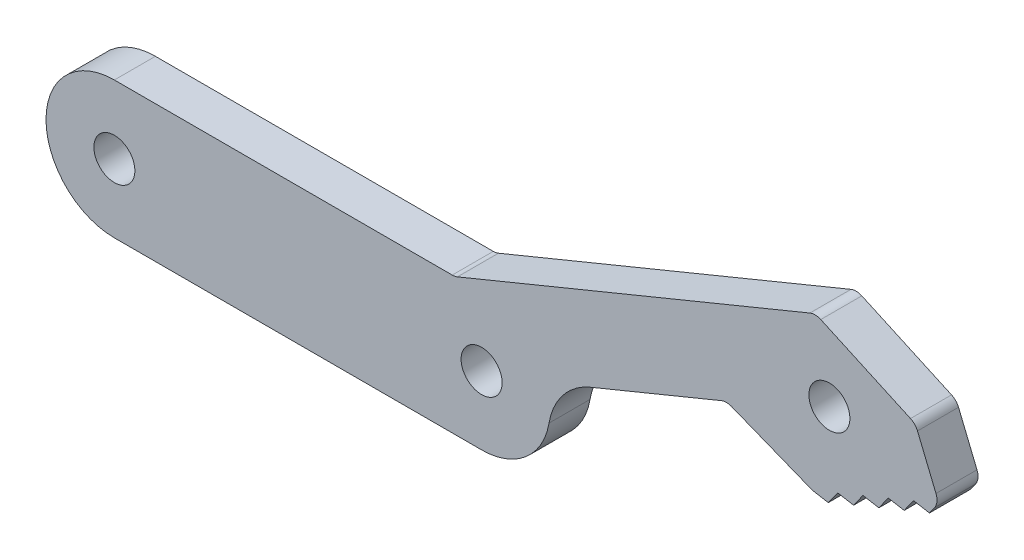
ISO-10303-21;
HEADER;
FILE_DESCRIPTION(('STEP AP214'),'2;1');
FILE_NAME('part.step','',(''),(''),'','','');
FILE_SCHEMA(('AUTOMOTIVE_DESIGN { 1 0 10303 214 1 1 1 1 }'));
ENDSEC;
DATA;
#1=APPLICATION_CONTEXT('core data for automotive mechanical design processes');
#2=APPLICATION_PROTOCOL_DEFINITION('international standard','automotive_design',2000,#1);
#3=PRODUCT_CONTEXT('',#1,'mechanical');
#4=PRODUCT('Part','Part','',(#3));
#5=PRODUCT_RELATED_PRODUCT_CATEGORY('part','',(#4));
#6=PRODUCT_DEFINITION_FORMATION('','',#4);
#7=PRODUCT_DEFINITION_CONTEXT('part definition',#1,'design');
#8=PRODUCT_DEFINITION('design','',#6,#7);
#9=PRODUCT_DEFINITION_SHAPE('','',#8);
#10=(LENGTH_UNIT() NAMED_UNIT(*) SI_UNIT(.MILLI.,.METRE.));
#11=(NAMED_UNIT(*) PLANE_ANGLE_UNIT() SI_UNIT($,.RADIAN.));
#12=(NAMED_UNIT(*) SI_UNIT($,.STERADIAN.) SOLID_ANGLE_UNIT());
#13=UNCERTAINTY_MEASURE_WITH_UNIT(LENGTH_MEASURE(1.E-05),#10,'distance_accuracy_value','');
#14=(GEOMETRIC_REPRESENTATION_CONTEXT(3) GLOBAL_UNCERTAINTY_ASSIGNED_CONTEXT((#13)) GLOBAL_UNIT_ASSIGNED_CONTEXT((#10,
#11,#12)) REPRESENTATION_CONTEXT('',''));
#15=CARTESIAN_POINT('',(0.,0.,0.));
#16=DIRECTION('',(0.,0.,1.));
#17=DIRECTION('',(1.,0.,0.));
#18=AXIS2_PLACEMENT_3D('',#15,#16,#17);
#19=CARTESIAN_POINT('',(34.3437879954881,-24.4421255077163,3.));
#20=DIRECTION('',(-0.814732571298574,0.579836905746108,0.));
#21=DIRECTION('',(-0.579836905746108,-0.814732571298574,0.));
#22=AXIS2_PLACEMENT_3D('',#19,#20,#21);
#23=PLANE('',#22);
#24=DIRECTION('',(0.,0.,1.));
#25=VECTOR('',#24,1.);
#26=CARTESIAN_POINT('',(56.5938553943796,6.82158751886203,3.));
#27=LINE('',#26,#25);
#28=CARTESIAN_POINT('',(56.5938553943796,6.82158751886203,0.));
#29=VERTEX_POINT('',#28);
#30=CARTESIAN_POINT('',(56.5938553943796,6.82158751886203,3.));
#31=VERTEX_POINT('',#30);
#32=EDGE_CURVE('E389',#29,#31,#27,.T.);
#33=ORIENTED_EDGE('',*,*,#32,.T.);
#34=DIRECTION('',(-0.579836905746108,-0.814732571298574,0.));
#35=VECTOR('',#34,1.);
#36=CARTESIAN_POINT('',(34.3437879954881,-24.4421255077163,3.));
#37=LINE('',#36,#35);
#38=CARTESIAN_POINT('',(55.9085431162351,5.85865082238394,3.));
#39=VERTEX_POINT('',#38);
#40=EDGE_CURVE('E412',#39,#31,#37,.F.);
#41=ORIENTED_EDGE('',*,*,#40,.F.);
#42=DIRECTION('',(0.,0.,1.));
#43=VECTOR('',#42,1.);
#44=CARTESIAN_POINT('',(55.9085431162351,5.85865082238394,3.));
#45=LINE('',#44,#43);
#46=CARTESIAN_POINT('',(55.9085431162351,5.85865082238394,0.));
#47=VERTEX_POINT('',#46);
#48=EDGE_CURVE('E398',#39,#47,#45,.F.);
#49=ORIENTED_EDGE('',*,*,#48,.T.);
#50=DIRECTION('',(-0.579836905746108,-0.814732571298574,0.));
#51=VECTOR('',#50,1.);
#52=CARTESIAN_POINT('',(34.3437879954881,-24.4421255077163,0.));
#53=LINE('',#52,#51);
#54=EDGE_CURVE('E404',#29,#47,#53,.T.);
#55=ORIENTED_EDGE('',*,*,#54,.F.);
#56=EDGE_LOOP('',(#33,#41,#49,#55));
#57=FACE_BOUND('',#56,.T.);
#58=ADVANCED_FACE('F16',(#57),#23,.F.);
#59=CARTESIAN_POINT('',(2.62825831831238,15.1201128790649,3.));
#60=DIRECTION('',(0.171257275030375,0.985226342395074,0.));
#61=DIRECTION('',(-0.985226342395074,0.171257275030375,0.));
#62=AXIS2_PLACEMENT_3D('',#59,#60,#61);
#63=PLANE('',#62);
#64=ORIENTED_EDGE('',*,*,#48,.F.);
#65=DIRECTION('',(-0.985226342395074,0.171257275030375,0.));
#66=VECTOR('',#65,1.);
#67=CARTESIAN_POINT('',(2.62825831831238,15.1201128790649,3.));
#68=LINE('',#67,#66);
#69=CARTESIAN_POINT('',(54.7440989380466,6.06106069339561,3.));
#70=VERTEX_POINT('',#69);
#71=EDGE_CURVE('E401',#70,#39,#68,.F.);
#72=ORIENTED_EDGE('',*,*,#71,.F.);
#73=DIRECTION('',(0.,0.,1.));
#74=VECTOR('',#73,1.);
#75=CARTESIAN_POINT('',(54.7440989380465,6.06106069339562,3.));
#76=LINE('',#75,#74);
#77=CARTESIAN_POINT('',(54.7440989380466,6.06106069339561,0.));
#78=VERTEX_POINT('',#77);
#79=EDGE_CURVE('E370',#70,#78,#76,.F.);
#80=ORIENTED_EDGE('',*,*,#79,.T.);
#81=DIRECTION('',(-0.985226342395074,0.171257275030375,0.));
#82=VECTOR('',#81,1.);
#83=CARTESIAN_POINT('',(2.62825831831238,15.1201128790649,0.));
#84=LINE('',#83,#82);
#85=EDGE_CURVE('E396',#47,#78,#84,.T.);
#86=ORIENTED_EDGE('',*,*,#85,.F.);
#87=EDGE_LOOP('',(#64,#72,#80,#86));
#88=FACE_BOUND('',#87,.T.);
#89=ADVANCED_FACE('F539',(#88),#63,.F.);
#90=CARTESIAN_POINT('',(2.81083147134707,16.1704383601417,3.));
#91=DIRECTION('',(0.171257275030359,0.985226342395078,0.));
#92=DIRECTION('',(-0.985226342395078,0.171257275030359,0.));
#93=AXIS2_PLACEMENT_3D('',#90,#91,#92);
#94=PLANE('',#93);
#95=DIRECTION('',(0.,0.,1.));
#96=VECTOR('',#95,1.);
#97=CARTESIAN_POINT('',(57.7582995725681,6.61917764785032,3.));
#98=LINE('',#97,#96);
#99=CARTESIAN_POINT('',(57.7582995725682,6.61917764785035,0.));
#100=VERTEX_POINT('',#99);
#101=CARTESIAN_POINT('',(57.7582995725682,6.61917764785035,3.));
#102=VERTEX_POINT('',#101);
#103=EDGE_CURVE('E361',#100,#102,#98,.T.);
#104=ORIENTED_EDGE('',*,*,#103,.T.);
#105=DIRECTION('',(-0.985226342395078,0.171257275030359,0.));
#106=VECTOR('',#105,1.);
#107=CARTESIAN_POINT('',(2.81083147134707,16.1704383601417,3.));
#108=LINE('',#107,#106);
#109=EDGE_CURVE('E385',#31,#102,#108,.F.);
#110=ORIENTED_EDGE('',*,*,#109,.F.);
#111=ORIENTED_EDGE('',*,*,#32,.F.);
#112=DIRECTION('',(-0.985226342395078,0.171257275030359,0.));
#113=VECTOR('',#112,1.);
#114=CARTESIAN_POINT('',(2.81083147134707,16.1704383601417,0.));
#115=LINE('',#114,#113);
#116=EDGE_CURVE('E376',#100,#29,#115,.T.);
#117=ORIENTED_EDGE('',*,*,#116,.F.);
#118=EDGE_LOOP('',(#104,#110,#111,#117));
#119=FACE_BOUND('',#118,.T.);
#120=ADVANCED_FACE('F532',(#119),#94,.F.);
#121=CARTESIAN_POINT('',(33.4752217147507,-23.8239756970912,3.));
#122=DIRECTION('',(-0.814732571298577,0.579836905746104,0.));
#123=DIRECTION('',(-0.579836905746104,-0.814732571298577,0.));
#124=AXIS2_PLACEMENT_3D('',#121,#122,#123);
#125=PLANE('',#124);
#126=ORIENTED_EDGE('',*,*,#79,.F.);
#127=DIRECTION('',(-0.579836905746104,-0.814732571298577,0.));
#128=VECTOR('',#127,1.);
#129=CARTESIAN_POINT('',(33.4752217147507,-23.8239756970912,3.));
#130=LINE('',#129,#128);
#131=CARTESIAN_POINT('',(54.058786659902,5.09812399691753,3.));
#132=VERTEX_POINT('',#131);
#133=EDGE_CURVE('E373',#132,#70,#130,.F.);
#134=ORIENTED_EDGE('',*,*,#133,.F.);
#135=DIRECTION('',(0.,0.,1.));
#136=VECTOR('',#135,1.);
#137=CARTESIAN_POINT('',(54.058786659902,5.09812399691753,3.));
#138=LINE('',#137,#136);
#139=CARTESIAN_POINT('',(54.058786659902,5.09812399691753,0.));
#140=VERTEX_POINT('',#139);
#141=EDGE_CURVE('E342',#132,#140,#138,.F.);
#142=ORIENTED_EDGE('',*,*,#141,.T.);
#143=DIRECTION('',(-0.579836905746104,-0.814732571298577,0.));
#144=VECTOR('',#143,1.);
#145=CARTESIAN_POINT('',(33.4752217147507,-23.8239756970912,0.));
#146=LINE('',#145,#144);
#147=EDGE_CURVE('E368',#78,#140,#146,.T.);
#148=ORIENTED_EDGE('',*,*,#147,.F.);
#149=EDGE_LOOP('',(#126,#134,#142,#148));
#150=FACE_BOUND('',#149,.T.);
#151=ADVANCED_FACE('F542',(#150),#125,.F.);
#152=CARTESIAN_POINT('',(35.2123542762261,-25.0602753183414,3.));
#153=DIRECTION('',(-0.814732571298576,0.579836905746104,0.));
#154=DIRECTION('',(-0.579836905746104,-0.814732571298576,0.));
#155=AXIS2_PLACEMENT_3D('',#152,#153,#154);
#156=PLANE('',#155);
#157=DIRECTION('',(0.,0.,1.));
#158=VECTOR('',#157,1.);
#159=CARTESIAN_POINT('',(58.4436118507129,7.58211434432848,3.));
#160=LINE('',#159,#158);
#161=CARTESIAN_POINT('',(58.4436118507128,7.58211434432845,0.));
#162=VERTEX_POINT('',#161);
#163=CARTESIAN_POINT('',(58.4436118507128,7.58211434432845,3.));
#164=VERTEX_POINT('',#163);
#165=EDGE_CURVE('E333',#162,#164,#160,.T.);
#166=ORIENTED_EDGE('',*,*,#165,.T.);
#167=DIRECTION('',(-0.579836905746104,-0.814732571298576,0.));
#168=VECTOR('',#167,1.);
#169=CARTESIAN_POINT('',(35.2123542762261,-25.0602753183414,3.));
#170=LINE('',#169,#168);
#171=EDGE_CURVE('E357',#102,#164,#170,.F.);
#172=ORIENTED_EDGE('',*,*,#171,.F.);
#173=ORIENTED_EDGE('',*,*,#103,.F.);
#174=DIRECTION('',(-0.579836905746104,-0.814732571298576,0.));
#175=VECTOR('',#174,1.);
#176=CARTESIAN_POINT('',(35.2123542762261,-25.0602753183414,0.));
#177=LINE('',#176,#175);
#178=EDGE_CURVE('E348',#162,#100,#177,.T.);
#179=ORIENTED_EDGE('',*,*,#178,.F.);
#180=EDGE_LOOP('',(#166,#172,#173,#179));
#181=FACE_BOUND('',#180,.T.);
#182=ADVANCED_FACE('F528',(#181),#156,.F.);
#183=CARTESIAN_POINT('',(2.44568516527722,14.0697873979871,3.));
#184=DIRECTION('',(0.171257275030374,0.985226342395075,0.));
#185=DIRECTION('',(-0.985226342395075,0.171257275030374,0.));
#186=AXIS2_PLACEMENT_3D('',#183,#184,#185);
#187=PLANE('',#186);
#188=ORIENTED_EDGE('',*,*,#141,.F.);
#189=DIRECTION('',(-0.985226342395075,0.171257275030374,0.));
#190=VECTOR('',#189,1.);
#191=CARTESIAN_POINT('',(2.44568516527722,14.0697873979871,3.));
#192=LINE('',#191,#190);
#193=CARTESIAN_POINT('',(52.8943424817137,5.30053386792931,3.));
#194=VERTEX_POINT('',#193);
#195=EDGE_CURVE('E345',#194,#132,#192,.F.);
#196=ORIENTED_EDGE('',*,*,#195,.F.);
#197=DIRECTION('',(0.,0.,1.));
#198=VECTOR('',#197,1.);
#199=CARTESIAN_POINT('',(52.8943424817137,5.30053386792931,3.));
#200=LINE('',#199,#198);
#201=CARTESIAN_POINT('',(52.8943424817137,5.30053386792931,0.));
#202=VERTEX_POINT('',#201);
#203=EDGE_CURVE('E316',#194,#202,#200,.F.);
#204=ORIENTED_EDGE('',*,*,#203,.T.);
#205=DIRECTION('',(-0.985226342395075,0.171257275030374,0.));
#206=VECTOR('',#205,1.);
#207=CARTESIAN_POINT('',(2.44568516527722,14.0697873979871,0.));
#208=LINE('',#207,#206);
#209=EDGE_CURVE('E340',#140,#202,#208,.T.);
#210=ORIENTED_EDGE('',*,*,#209,.F.);
#211=EDGE_LOOP('',(#188,#196,#204,#210));
#212=FACE_BOUND('',#211,.T.);
#213=ADVANCED_FACE('F546',(#212),#187,.F.);
#214=CARTESIAN_POINT('',(2.9934046243824,17.2207638412199,3.));
#215=DIRECTION('',(0.171257275030367,0.985226342395076,0.));
#216=DIRECTION('',(-0.985226342395076,0.171257275030367,0.));
#217=AXIS2_PLACEMENT_3D('',#214,#215,#216);
#218=PLANE('',#217);
#219=DIRECTION('',(0.,0.,1.));
#220=VECTOR('',#219,1.);
#221=CARTESIAN_POINT('',(59.6080560289013,7.37970447331675,3.));
#222=LINE('',#221,#220);
#223=CARTESIAN_POINT('',(59.6080560289013,7.37970447331675,0.));
#224=VERTEX_POINT('',#223);
#225=CARTESIAN_POINT('',(59.6080560289013,7.37970447331675,3.));
#226=VERTEX_POINT('',#225);
#227=EDGE_CURVE('E302',#224,#226,#222,.T.);
#228=ORIENTED_EDGE('',*,*,#227,.T.);
#229=DIRECTION('',(-0.985226342395076,0.171257275030367,0.));
#230=VECTOR('',#229,1.);
#231=CARTESIAN_POINT('',(2.9934046243824,17.2207638412199,3.));
#232=LINE('',#231,#230);
#233=EDGE_CURVE('E329',#164,#226,#232,.F.);
#234=ORIENTED_EDGE('',*,*,#233,.F.);
#235=ORIENTED_EDGE('',*,*,#165,.F.);
#236=DIRECTION('',(-0.985226342395076,0.171257275030367,0.));
#237=VECTOR('',#236,1.);
#238=CARTESIAN_POINT('',(2.9934046243824,17.2207638412199,0.));
#239=LINE('',#238,#237);
#240=EDGE_CURVE('E317',#224,#162,#239,.T.);
#241=ORIENTED_EDGE('',*,*,#240,.F.);
#242=EDGE_LOOP('',(#228,#234,#235,#241));
#243=FACE_BOUND('',#242,.T.);
#244=ADVANCED_FACE('F524',(#243),#218,.F.);
#245=CARTESIAN_POINT('',(32.606655434013,-23.2058258864661,3.));
#246=DIRECTION('',(-0.814732571298577,0.579836905746104,0.));
#247=DIRECTION('',(-0.579836905746104,-0.814732571298577,0.));
#248=AXIS2_PLACEMENT_3D('',#245,#246,#247);
#249=PLANE('',#248);
#250=ORIENTED_EDGE('',*,*,#203,.F.);
#251=DIRECTION('',(-0.579836905746104,-0.814732571298577,0.));
#252=VECTOR('',#251,1.);
#253=CARTESIAN_POINT('',(32.606655434013,-23.2058258864661,3.));
#254=LINE('',#253,#252);
#255=CARTESIAN_POINT('',(52.2090302035688,4.33759717145109,3.));
#256=VERTEX_POINT('',#255);
#257=EDGE_CURVE('E313',#256,#194,#254,.F.);
#258=ORIENTED_EDGE('',*,*,#257,.F.);
#259=DIRECTION('',(0.,0.,1.));
#260=VECTOR('',#259,1.);
#261=CARTESIAN_POINT('',(52.2090302035688,4.33759717145109,3.));
#262=LINE('',#261,#260);
#263=CARTESIAN_POINT('',(52.2090302035688,4.33759717145109,0.));
#264=VERTEX_POINT('',#263);
#265=EDGE_CURVE('E296',#256,#264,#262,.F.);
#266=ORIENTED_EDGE('',*,*,#265,.T.);
#267=DIRECTION('',(-0.579836905746104,-0.814732571298577,0.));
#268=VECTOR('',#267,1.);
#269=CARTESIAN_POINT('',(32.606655434013,-23.2058258864661,0.));
#270=LINE('',#269,#268);
#271=EDGE_CURVE('E90',#202,#264,#270,.T.);
#272=ORIENTED_EDGE('',*,*,#271,.F.);
#273=EDGE_LOOP('',(#250,#258,#266,#272));
#274=FACE_BOUND('',#273,.T.);
#275=ADVANCED_FACE('F549',(#274),#249,.F.);
#276=CARTESIAN_POINT('',(36.080920556963,-25.6784251289667,3.));
#277=DIRECTION('',(-0.814732571298569,0.579836905746115,0.));
#278=DIRECTION('',(-0.579836905746115,-0.814732571298569,0.));
#279=AXIS2_PLACEMENT_3D('',#276,#277,#278);
#280=PLANE('',#279);
#281=DIRECTION('',(0.,0.,1.));
#282=VECTOR('',#281,1.);
#283=CARTESIAN_POINT('',(59.9733532795215,7.8929859932349,3.));
#284=LINE('',#283,#282);
#285=CARTESIAN_POINT('',(59.9733532795215,7.8929859932349,3.));
#286=VERTEX_POINT('',#285);
#287=CARTESIAN_POINT('',(59.9733532795215,7.8929859932349,0.));
#288=VERTEX_POINT('',#287);
#289=EDGE_CURVE('E291',#286,#288,#284,.F.);
#290=ORIENTED_EDGE('',*,*,#289,.F.);
#291=DIRECTION('',(-0.579836905746115,-0.814732571298569,0.));
#292=VECTOR('',#291,1.);
#293=CARTESIAN_POINT('',(36.080920556963,-25.6784251289667,3.));
#294=LINE('',#293,#292);
#295=EDGE_CURVE('E299',#226,#286,#294,.F.);
#296=ORIENTED_EDGE('',*,*,#295,.F.);
#297=ORIENTED_EDGE('',*,*,#227,.F.);
#298=DIRECTION('',(-0.579836905746115,-0.814732571298569,0.));
#299=VECTOR('',#298,1.);
#300=CARTESIAN_POINT('',(36.080920556963,-25.6784251289667,0.));
#301=LINE('',#300,#299);
#302=EDGE_CURVE('E301',#288,#224,#301,.T.);
#303=ORIENTED_EDGE('',*,*,#302,.F.);
#304=EDGE_LOOP('',(#290,#296,#297,#303));
#305=FACE_BOUND('',#304,.T.);
#306=ADVANCED_FACE('F520',(#305),#280,.F.);
#307=CARTESIAN_POINT('',(2.26311201224211,13.0194619169094,3.));
#308=DIRECTION('',(0.171257275030375,0.985226342395075,0.));
#309=DIRECTION('',(-0.985226342395075,0.171257275030375,0.));
#310=AXIS2_PLACEMENT_3D('',#307,#308,#309);
#311=PLANE('',#310);
#312=DIRECTION('',(0.,0.,1.));
#313=VECTOR('',#312,1.);
#314=CARTESIAN_POINT('',(51.1463043078328,4.52232583041646,3.));
#315=LINE('',#314,#313);
#316=CARTESIAN_POINT('',(51.1463043078328,4.52232583041646,0.));
#317=VERTEX_POINT('',#316);
#318=CARTESIAN_POINT('',(51.1463043078328,4.52232583041646,3.));
#319=VERTEX_POINT('',#318);
#320=EDGE_CURVE('E284',#317,#319,#315,.T.);
#321=ORIENTED_EDGE('',*,*,#320,.F.);
#322=DIRECTION('',(-0.985226342395075,0.171257275030375,0.));
#323=VECTOR('',#322,1.);
#324=CARTESIAN_POINT('',(2.26311201224211,13.0194619169094,0.));
#325=LINE('',#324,#323);
#326=EDGE_CURVE('E292',#264,#317,#325,.T.);
#327=ORIENTED_EDGE('',*,*,#326,.F.);
#328=ORIENTED_EDGE('',*,*,#265,.F.);
#329=DIRECTION('',(-0.985226342395075,0.171257275030375,0.));
#330=VECTOR('',#329,1.);
#331=CARTESIAN_POINT('',(2.26311201224211,13.0194619169094,3.));
#332=LINE('',#331,#330);
#333=EDGE_CURVE('E288',#319,#256,#332,.F.);
#334=ORIENTED_EDGE('',*,*,#333,.F.);
#335=EDGE_LOOP('',(#321,#327,#328,#334));
#336=FACE_BOUND('',#335,.T.);
#337=ADVANCED_FACE('F555',(#336),#311,.F.);
#338=CARTESIAN_POINT('',(51.3175615828632,5.50755217281154,3.));
#339=DIRECTION('',(0.,0.,1.));
#340=DIRECTION('',(1.,0.,0.));
#341=AXIS2_PLACEMENT_3D('',#338,#339,#340);
#342=CYLINDRICAL_SURFACE('',#341,1.);
#343=CARTESIAN_POINT('',(51.3175615828632,5.50755217281154,0.));
#344=DIRECTION('',(0.,0.,1.));
#345=DIRECTION('',(1.,0.,0.));
#346=AXIS2_PLACEMENT_3D('',#343,#344,#345);
#347=CIRCLE('',#346,1.);
#348=CARTESIAN_POINT('',(50.9486257874037,4.57809729019025,0.));
#349=VERTEX_POINT('',#348);
#350=EDGE_CURVE('E19',#349,#317,#347,.T.);
#351=ORIENTED_EDGE('',*,*,#350,.T.);
#352=ORIENTED_EDGE('',*,*,#320,.T.);
#353=CARTESIAN_POINT('',(51.3175615828632,5.50755217281154,3.));
#354=DIRECTION('',(0.,0.,1.));
#355=DIRECTION('',(1.,0.,0.));
#356=AXIS2_PLACEMENT_3D('',#353,#354,#355);
#357=CIRCLE('',#356,1.);
#358=CARTESIAN_POINT('',(50.9486257874037,4.57809729019025,3.));
#359=VERTEX_POINT('',#358);
#360=EDGE_CURVE('E449',#359,#319,#357,.T.);
#361=ORIENTED_EDGE('',*,*,#360,.F.);
#362=DIRECTION('',(0.,0.,1.));
#363=VECTOR('',#362,1.);
#364=CARTESIAN_POINT('',(50.9486257874037,4.57809729019025,3.));
#365=LINE('',#364,#363);
#366=EDGE_CURVE('E247',#349,#359,#365,.T.);
#367=ORIENTED_EDGE('',*,*,#366,.F.);
#368=EDGE_LOOP('',(#351,#352,#361,#367));
#369=FACE_BOUND('',#368,.T.);
#370=ADVANCED_FACE('F557',(#369),#342,.T.);
#371=CARTESIAN_POINT('',(44.7628507420591,5.95756590223532,3.));
#372=DIRECTION('',(0.,0.,1.));
#373=DIRECTION('',(1.,0.,0.));
#374=AXIS2_PLACEMENT_3D('',#371,#372,#373);
#375=CYLINDRICAL_SURFACE('',#374,1.);
#376=DIRECTION('',(0.,0.,1.));
#377=VECTOR('',#376,1.);
#378=CARTESIAN_POINT('',(44.3825873293259,6.88244413040186,3.));
#379=LINE('',#378,#377);
#380=CARTESIAN_POINT('',(44.3825873293259,6.88244413040185,0.));
#381=VERTEX_POINT('',#380);
#382=CARTESIAN_POINT('',(44.3825873293259,6.88244413040185,3.));
#383=VERTEX_POINT('',#382);
#384=EDGE_CURVE('E249',#381,#383,#379,.T.);
#385=ORIENTED_EDGE('',*,*,#384,.F.);
#386=CARTESIAN_POINT('',(44.7628507420591,5.95756590223532,0.));
#387=DIRECTION('',(0.,0.,1.));
#388=DIRECTION('',(1.,0.,0.));
#389=AXIS2_PLACEMENT_3D('',#386,#387,#388);
#390=CIRCLE('',#389,1.);
#391=CARTESIAN_POINT('',(45.1317865375187,6.88702078485664,0.));
#392=VERTEX_POINT('',#391);
#393=EDGE_CURVE('E287',#392,#381,#390,.T.);
#394=ORIENTED_EDGE('',*,*,#393,.F.);
#395=DIRECTION('',(0.,0.,1.));
#396=VECTOR('',#395,1.);
#397=CARTESIAN_POINT('',(45.1317865375187,6.88702078485664,3.));
#398=LINE('',#397,#396);
#399=CARTESIAN_POINT('',(45.1317865375187,6.88702078485668,3.));
#400=VERTEX_POINT('',#399);
#401=EDGE_CURVE('E243',#400,#392,#398,.F.);
#402=ORIENTED_EDGE('',*,*,#401,.F.);
#403=CARTESIAN_POINT('',(44.7628507420591,5.95756590223532,3.));
#404=DIRECTION('',(0.,0.,1.));
#405=DIRECTION('',(1.,0.,0.));
#406=AXIS2_PLACEMENT_3D('',#403,#404,#405);
#407=CIRCLE('',#406,1.);
#408=EDGE_CURVE('E452',#383,#400,#407,.F.);
#409=ORIENTED_EDGE('',*,*,#408,.F.);
#410=EDGE_LOOP('',(#385,#394,#402,#409));
#411=FACE_BOUND('',#410,.T.);
#412=ADVANCED_FACE('F471',(#411),#375,.F.);
#413=CARTESIAN_POINT('',(59.1586207082228,8.47282289898096,3.));
#414=DIRECTION('',(0.,0.,1.));
#415=DIRECTION('',(1.,0.,0.));
#416=AXIS2_PLACEMENT_3D('',#413,#414,#415);
#417=CYLINDRICAL_SURFACE('',#416,1.);
#418=DIRECTION('',(0.,0.,1.));
#419=VECTOR('',#418,1.);
#420=CARTESIAN_POINT('',(60.0834989363894,8.85308631171421,3.));
#421=LINE('',#420,#419);
#422=CARTESIAN_POINT('',(60.0834989363894,8.85308631171421,3.));
#423=VERTEX_POINT('',#422);
#424=CARTESIAN_POINT('',(60.0834989363894,8.85308631171421,0.));
#425=VERTEX_POINT('',#424);
#426=EDGE_CURVE('E237',#423,#425,#421,.F.);
#427=ORIENTED_EDGE('',*,*,#426,.F.);
#428=CARTESIAN_POINT('',(59.1586207082228,8.47282289898096,3.));
#429=DIRECTION('',(0.,0.,1.));
#430=DIRECTION('',(1.,0.,0.));
#431=AXIS2_PLACEMENT_3D('',#428,#429,#430);
#432=CIRCLE('',#431,1.);
#433=EDGE_CURVE('E75',#286,#423,#432,.T.);
#434=ORIENTED_EDGE('',*,*,#433,.F.);
#435=ORIENTED_EDGE('',*,*,#289,.T.);
#436=CARTESIAN_POINT('',(59.1586207082228,8.47282289898096,0.));
#437=DIRECTION('',(0.,0.,1.));
#438=DIRECTION('',(1.,0.,0.));
#439=AXIS2_PLACEMENT_3D('',#436,#437,#438);
#440=CIRCLE('',#439,1.);
#441=EDGE_CURVE('E82',#288,#425,#440,.T.);
#442=ORIENTED_EDGE('',*,*,#441,.T.);
#443=EDGE_LOOP('',(#427,#434,#435,#442));
#444=FACE_BOUND('',#443,.T.);
#445=ADVANCED_FACE('F516',(#444),#417,.T.);
#446=CARTESIAN_POINT('',(57.8077110715061,11.7585108441848,3.));
#447=DIRECTION('',(0.,0.,-1.));
#448=DIRECTION('',(-1.,0.,0.));
#449=AXIS2_PLACEMENT_3D('',#446,#447,#448);
#450=CYLINDRICAL_SURFACE('',#449,1.);
#451=CARTESIAN_POINT('',(57.8077110715061,11.7585108441848,0.));
#452=DIRECTION('',(0.,0.,-1.));
#453=DIRECTION('',(-1.,0.,0.));
#454=AXIS2_PLACEMENT_3D('',#451,#452,#453);
#455=CIRCLE('',#454,1.);
#456=CARTESIAN_POINT('',(58.7325892996728,12.1387742569181,0.));
#457=VERTEX_POINT('',#456);
#458=CARTESIAN_POINT('',(58.2222333314382,12.6685500169795,0.));
#459=VERTEX_POINT('',#458);
#460=EDGE_CURVE('E458',#457,#459,#455,.F.);
#461=ORIENTED_EDGE('',*,*,#460,.T.);
#462=DIRECTION('',(0.,0.,1.));
#463=VECTOR('',#462,1.);
#464=CARTESIAN_POINT('',(58.2222333314383,12.6685500169795,3.));
#465=LINE('',#464,#463);
#466=CARTESIAN_POINT('',(58.2222333314382,12.6685500169795,3.));
#467=VERTEX_POINT('',#466);
#468=EDGE_CURVE('E232',#467,#459,#465,.F.);
#469=ORIENTED_EDGE('',*,*,#468,.F.);
#470=CARTESIAN_POINT('',(57.8077110715061,11.7585108441848,3.));
#471=DIRECTION('',(0.,0.,-1.));
#472=DIRECTION('',(-1.,0.,0.));
#473=AXIS2_PLACEMENT_3D('',#470,#471,#472);
#474=CIRCLE('',#473,1.);
#475=CARTESIAN_POINT('',(58.7325892996727,12.138774256918,3.));
#476=VERTEX_POINT('',#475);
#477=EDGE_CURVE('E446',#476,#467,#474,.F.);
#478=ORIENTED_EDGE('',*,*,#477,.F.);
#479=DIRECTION('',(0.,0.,1.));
#480=VECTOR('',#479,1.);
#481=CARTESIAN_POINT('',(58.7325892996727,12.138774256918,3.));
#482=LINE('',#481,#480);
#483=EDGE_CURVE('E241',#457,#476,#482,.T.);
#484=ORIENTED_EDGE('',*,*,#483,.F.);
#485=EDGE_LOOP('',(#461,#469,#478,#484));
#486=FACE_BOUND('',#485,.T.);
#487=ADVANCED_FACE('F515',(#486),#450,.T.);
#488=CARTESIAN_POINT('',(24.708546068055,6.,3.));
#489=DIRECTION('',(0.,0.,1.));
#490=DIRECTION('',(1.,0.,0.));
#491=AXIS2_PLACEMENT_3D('',#488,#489,#490);
#492=CYLINDRICAL_SURFACE('',#491,1.);
#493=DIRECTION('',(0.,0.,1.));
#494=VECTOR('',#493,1.);
#495=CARTESIAN_POINT('',(25.0888094807882,5.07512177183346,3.));
#496=LINE('',#495,#494);
#497=CARTESIAN_POINT('',(25.0888094807882,5.07512177183346,0.));
#498=VERTEX_POINT('',#497);
#499=CARTESIAN_POINT('',(25.0888094807882,5.07512177183346,3.));
#500=VERTEX_POINT('',#499);
#501=EDGE_CURVE('E218',#498,#500,#496,.T.);
#502=ORIENTED_EDGE('',*,*,#501,.F.);
#503=CARTESIAN_POINT('',(24.708546068055,6.,0.));
#504=DIRECTION('',(0.,0.,1.));
#505=DIRECTION('',(1.,0.,0.));
#506=AXIS2_PLACEMENT_3D('',#503,#504,#505);
#507=CIRCLE('',#506,1.);
#508=CARTESIAN_POINT('',(24.708546068055,5.,0.));
#509=VERTEX_POINT('',#508);
#510=EDGE_CURVE('E456',#509,#498,#507,.T.);
#511=ORIENTED_EDGE('',*,*,#510,.F.);
#512=DIRECTION('',(0.,0.,1.));
#513=VECTOR('',#512,1.);
#514=CARTESIAN_POINT('',(24.708546068055,5.,3.));
#515=LINE('',#514,#513);
#516=CARTESIAN_POINT('',(24.708546068055,5.,3.));
#517=VERTEX_POINT('',#516);
#518=EDGE_CURVE('E269',#517,#509,#515,.F.);
#519=ORIENTED_EDGE('',*,*,#518,.F.);
#520=CARTESIAN_POINT('',(24.708546068055,6.,3.));
#521=DIRECTION('',(0.,0.,1.));
#522=DIRECTION('',(1.,0.,0.));
#523=AXIS2_PLACEMENT_3D('',#520,#521,#522);
#524=CIRCLE('',#523,1.);
#525=EDGE_CURVE('E210',#500,#517,#524,.F.);
#526=ORIENTED_EDGE('',*,*,#525,.F.);
#527=EDGE_LOOP('',(#502,#511,#519,#526));
#528=FACE_BOUND('',#527,.T.);
#529=ADVANCED_FACE('F502',(#528),#492,.F.);
#530=CARTESIAN_POINT('',(51.2447843463113,14.7479197611021,3.));
#531=DIRECTION('',(0.,0.,-1.));
#532=DIRECTION('',(-1.,0.,0.));
#533=AXIS2_PLACEMENT_3D('',#530,#531,#532);
#534=CYLINDRICAL_SURFACE('',#533,1.);
#535=CARTESIAN_POINT('',(51.2447843463113,14.7479197611021,0.));
#536=DIRECTION('',(0.,0.,-1.));
#537=DIRECTION('',(-1.,0.,0.));
#538=AXIS2_PLACEMENT_3D('',#535,#536,#537);
#539=CIRCLE('',#538,1.);
#540=CARTESIAN_POINT('',(51.6593066062434,15.6579589338968,0.));
#541=VERTEX_POINT('',#540);
#542=CARTESIAN_POINT('',(50.8645209335782,15.6727979892688,0.));
#543=VERTEX_POINT('',#542);
#544=EDGE_CURVE('E34',#541,#543,#539,.F.);
#545=ORIENTED_EDGE('',*,*,#544,.T.);
#546=DIRECTION('',(0.,0.,1.));
#547=VECTOR('',#546,1.);
#548=CARTESIAN_POINT('',(50.8645209335783,15.6727979892688,3.));
#549=LINE('',#548,#547);
#550=CARTESIAN_POINT('',(50.8645209335782,15.6727979892688,3.));
#551=VERTEX_POINT('',#550);
#552=EDGE_CURVE('E215',#551,#543,#549,.F.);
#553=ORIENTED_EDGE('',*,*,#552,.F.);
#554=CARTESIAN_POINT('',(51.2447843463113,14.7479197611021,3.));
#555=DIRECTION('',(0.,0.,-1.));
#556=DIRECTION('',(-1.,0.,0.));
#557=AXIS2_PLACEMENT_3D('',#554,#555,#556);
#558=CIRCLE('',#557,1.);
#559=CARTESIAN_POINT('',(51.6593066062434,15.6579589338968,3.));
#560=VERTEX_POINT('',#559);
#561=EDGE_CURVE('E202',#560,#551,#558,.F.);
#562=ORIENTED_EDGE('',*,*,#561,.F.);
#563=DIRECTION('',(0.,0.,1.));
#564=VECTOR('',#563,1.);
#565=CARTESIAN_POINT('',(51.6593066062434,15.6579589338968,3.));
#566=LINE('',#565,#564);
#567=EDGE_CURVE('E235',#541,#560,#566,.T.);
#568=ORIENTED_EDGE('',*,*,#567,.F.);
#569=EDGE_LOOP('',(#545,#553,#562,#568));
#570=FACE_BOUND('',#569,.T.);
#571=ADVANCED_FACE('F221',(#570),#534,.T.);
#572=CARTESIAN_POINT('',(0.,0.,3.));
#573=DIRECTION('',(0.,0.,1.));
#574=DIRECTION('',(1.,0.,0.));
#575=AXIS2_PLACEMENT_3D('',#572,#573,#574);
#576=PLANE('',#575);
#577=CARTESIAN_POINT('',(52.2902492745801,10.4572438501632,3.));
#578=DIRECTION('',(0.,0.,-1.));
#579=DIRECTION('',(-1.,0.,0.));
#580=AXIS2_PLACEMENT_3D('',#577,#578,#579);
#581=CIRCLE('',#580,1.5);
#582=CARTESIAN_POINT('',(50.7902492745801,10.4572438501632,3.));
#583=VERTEX_POINT('',#582);
#584=EDGE_CURVE('E222',#583,#583,#581,.T.);
#585=ORIENTED_EDGE('',*,*,#584,.T.);
#586=EDGE_LOOP('',(#585));
#587=FACE_BOUND('',#586,.T.);
#588=DIRECTION('',(-0.380263412733211,0.924878228166551,0.));
#589=VECTOR('',#588,1.);
#590=CARTESIAN_POINT('',(54.5090161920035,22.4113660486865,3.));
#591=LINE('',#590,#589);
#592=EDGE_CURVE('E240',#476,#423,#591,.F.);
#593=ORIENTED_EDGE('',*,*,#592,.F.);
#594=ORIENTED_EDGE('',*,*,#477,.T.);
#595=DIRECTION('',(-0.910039172794667,0.414522259932088,0.));
#596=VECTOR('',#595,1.);
#597=CARTESIAN_POINT('',(14.7832269525943,32.4549895809669,3.));
#598=LINE('',#597,#596);
#599=EDGE_CURVE('E209',#560,#467,#598,.F.);
#600=ORIENTED_EDGE('',*,*,#599,.F.);
#601=ORIENTED_EDGE('',*,*,#561,.T.);
#602=DIRECTION('',(-0.924878228166552,-0.380263412733207,0.));
#603=VECTOR('',#602,1.);
#604=CARTESIAN_POINT('',(1.84294156565917,-4.48241001575719,3.));
#605=LINE('',#604,#603);
#606=EDGE_CURVE('E207',#500,#551,#605,.F.);
#607=ORIENTED_EDGE('',*,*,#606,.F.);
#608=ORIENTED_EDGE('',*,*,#525,.T.);
#609=DIRECTION('',(-1.,0.,0.));
#610=VECTOR('',#609,1.);
#611=CARTESIAN_POINT('',(0.,5.,3.));
#612=LINE('',#611,#610);
#613=CARTESIAN_POINT('',(0.,5.,3.));
#614=VERTEX_POINT('',#613);
#615=EDGE_CURVE('E271',#614,#517,#612,.F.);
#616=ORIENTED_EDGE('',*,*,#615,.F.);
#617=CARTESIAN_POINT('',(0.,0.,3.));
#618=DIRECTION('',(0.,0.,-1.));
#619=DIRECTION('',(-1.,0.,0.));
#620=AXIS2_PLACEMENT_3D('',#617,#618,#619);
#621=CIRCLE('',#620,5.);
#622=CARTESIAN_POINT('',(0.,-5.,3.));
#623=VERTEX_POINT('',#622);
#624=EDGE_CURVE('E266',#623,#614,#621,.T.);
#625=ORIENTED_EDGE('',*,*,#624,.F.);
#626=DIRECTION('',(-1.,0.,0.));
#627=VECTOR('',#626,1.);
#628=CARTESIAN_POINT('',(0.,-5.,3.));
#629=LINE('',#628,#627);
#630=CARTESIAN_POINT('',(26.856098,-5.00000000000001,3.));
#631=VERTEX_POINT('',#630);
#632=EDGE_CURVE('E265',#623,#631,#629,.F.);
#633=ORIENTED_EDGE('',*,*,#632,.T.);
#634=CARTESIAN_POINT('',(26.856098,0.,3.));
#635=DIRECTION('',(0.,0.,-1.));
#636=DIRECTION('',(-1.,0.,0.));
#637=AXIS2_PLACEMENT_3D('',#634,#635,#636);
#638=CIRCLE('',#637,5.);
#639=CARTESIAN_POINT('',(31.7853419936476,-0.838184735657367,3.));
#640=VERTEX_POINT('',#639);
#641=EDGE_CURVE('E261',#640,#631,#638,.T.);
#642=ORIENTED_EDGE('',*,*,#641,.F.);
#643=CARTESIAN_POINT('',(36.7145859872952,-1.67636947131473,3.));
#644=DIRECTION('',(0.,0.,-1.));
#645=DIRECTION('',(-1.,0.,0.));
#646=AXIS2_PLACEMENT_3D('',#643,#644,#645);
#647=CIRCLE('',#646,5.);
#648=CARTESIAN_POINT('',(34.8132689236292,2.94802166951803,3.));
#649=VERTEX_POINT('',#648);
#650=EDGE_CURVE('E258',#640,#649,#647,.T.);
#651=ORIENTED_EDGE('',*,*,#650,.T.);
#652=DIRECTION('',(0.924878228166552,0.380263412733208,0.));
#653=VECTOR('',#652,1.);
#654=CARTESIAN_POINT('',(3.99719643140256,-9.72199751361041,3.));
#655=LINE('',#654,#653);
#656=EDGE_CURVE('E252',#383,#649,#655,.F.);
#657=ORIENTED_EDGE('',*,*,#656,.F.);
#658=ORIENTED_EDGE('',*,*,#408,.T.);
#659=DIRECTION('',(0.929454882621319,-0.368935795459583,0.));
#660=VECTOR('',#659,1.);
#661=CARTESIAN_POINT('',(8.50467352117956,21.4257072006626,3.));
#662=LINE('',#661,#660);
#663=EDGE_CURVE('E246',#359,#400,#662,.F.);
#664=ORIENTED_EDGE('',*,*,#663,.F.);
#665=ORIENTED_EDGE('',*,*,#360,.T.);
#666=ORIENTED_EDGE('',*,*,#333,.T.);
#667=ORIENTED_EDGE('',*,*,#257,.T.);
#668=ORIENTED_EDGE('',*,*,#195,.T.);
#669=ORIENTED_EDGE('',*,*,#133,.T.);
#670=ORIENTED_EDGE('',*,*,#71,.T.);
#671=ORIENTED_EDGE('',*,*,#40,.T.);
#672=ORIENTED_EDGE('',*,*,#109,.T.);
#673=ORIENTED_EDGE('',*,*,#171,.T.);
#674=ORIENTED_EDGE('',*,*,#233,.T.);
#675=ORIENTED_EDGE('',*,*,#295,.T.);
#676=ORIENTED_EDGE('',*,*,#433,.T.);
#677=EDGE_LOOP('',(#593,#594,#600,#601,#607,#608,#616,#625,#633,#642,#651,#657,#658,#664,#665,
#666,#667,#668,#669,#670,#671,#672,#673,#674,#675,#676));
#678=FACE_BOUND('',#677,.T.);
#679=CARTESIAN_POINT('',(0.,0.,3.));
#680=DIRECTION('',(0.,0.,-1.));
#681=DIRECTION('',(-1.,0.,0.));
#682=AXIS2_PLACEMENT_3D('',#679,#680,#681);
#683=CIRCLE('',#682,1.5);
#684=CARTESIAN_POINT('',(-1.5,0.,3.));
#685=VERTEX_POINT('',#684);
#686=EDGE_CURVE('E283',#685,#685,#683,.T.);
#687=ORIENTED_EDGE('',*,*,#686,.T.);
#688=EDGE_LOOP('',(#687));
#689=FACE_BOUND('',#688,.T.);
#690=CARTESIAN_POINT('',(26.856098,0.,3.));
#691=DIRECTION('',(0.,0.,-1.));
#692=DIRECTION('',(-1.,0.,0.));
#693=AXIS2_PLACEMENT_3D('',#690,#691,#692);
#694=CIRCLE('',#693,1.5);
#695=CARTESIAN_POINT('',(25.356098,0.,3.));
#696=VERTEX_POINT('',#695);
#697=EDGE_CURVE('E443',#696,#696,#694,.T.);
#698=ORIENTED_EDGE('',*,*,#697,.T.);
#699=EDGE_LOOP('',(#698));
#700=FACE_BOUND('',#699,.T.);
#701=ADVANCED_FACE('F205',(#587,#678,#689,#700),#576,.T.);
#702=CARTESIAN_POINT('',(26.856098,0.,3.));
#703=DIRECTION('',(0.,0.,-1.));
#704=DIRECTION('',(-1.,0.,0.));
#705=AXIS2_PLACEMENT_3D('',#702,#703,#704);
#706=CYLINDRICAL_SURFACE('',#705,1.5);
#707=CARTESIAN_POINT('',(26.856098,0.,0.));
#708=DIRECTION('',(0.,0.,-1.));
#709=DIRECTION('',(-1.,0.,0.));
#710=AXIS2_PLACEMENT_3D('',#707,#708,#709);
#711=CIRCLE('',#710,1.5);
#712=CARTESIAN_POINT('',(25.356098,0.,0.));
#713=VERTEX_POINT('',#712);
#714=EDGE_CURVE('E225',#713,#713,#711,.T.);
#715=ORIENTED_EDGE('',*,*,#714,.T.);
#716=EDGE_LOOP('',(#715));
#717=FACE_BOUND('',#716,.T.);
#718=ORIENTED_EDGE('',*,*,#697,.F.);
#719=EDGE_LOOP('',(#718));
#720=FACE_BOUND('',#719,.T.);
#721=ADVANCED_FACE('F676',(#717,#720),#706,.F.);
#722=CARTESIAN_POINT('',(0.,0.,3.));
#723=DIRECTION('',(0.,0.,-1.));
#724=DIRECTION('',(-1.,0.,0.));
#725=AXIS2_PLACEMENT_3D('',#722,#723,#724);
#726=CYLINDRICAL_SURFACE('',#725,1.5);
#727=CARTESIAN_POINT('',(0.,0.,0.));
#728=DIRECTION('',(0.,0.,-1.));
#729=DIRECTION('',(-1.,0.,0.));
#730=AXIS2_PLACEMENT_3D('',#727,#728,#729);
#731=CIRCLE('',#730,1.5);
#732=CARTESIAN_POINT('',(-1.5,0.,0.));
#733=VERTEX_POINT('',#732);
#734=EDGE_CURVE('E432',#733,#733,#731,.T.);
#735=ORIENTED_EDGE('',*,*,#734,.T.);
#736=EDGE_LOOP('',(#735));
#737=FACE_BOUND('',#736,.T.);
#738=ORIENTED_EDGE('',*,*,#686,.F.);
#739=EDGE_LOOP('',(#738));
#740=FACE_BOUND('',#739,.T.);
#741=ADVANCED_FACE('F668',(#737,#740),#726,.F.);
#742=CARTESIAN_POINT('',(0.,5.,3.));
#743=DIRECTION('',(0.,1.,0.));
#744=DIRECTION('',(-1.,0.,0.));
#745=AXIS2_PLACEMENT_3D('',#742,#743,#744);
#746=PLANE('',#745);
#747=DIRECTION('',(1.,0.,0.));
#748=VECTOR('',#747,1.);
#749=CARTESIAN_POINT('',(0.,5.,0.));
#750=LINE('',#749,#748);
#751=CARTESIAN_POINT('',(0.,5.,0.));
#752=VERTEX_POINT('',#751);
#753=EDGE_CURVE('E229',#509,#752,#750,.F.);
#754=ORIENTED_EDGE('',*,*,#753,.T.);
#755=DIRECTION('',(0.,0.,-1.));
#756=VECTOR('',#755,1.);
#757=CARTESIAN_POINT('',(0.,5.,3.));
#758=LINE('',#757,#756);
#759=EDGE_CURVE('E267',#614,#752,#758,.T.);
#760=ORIENTED_EDGE('',*,*,#759,.F.);
#761=ORIENTED_EDGE('',*,*,#615,.T.);
#762=ORIENTED_EDGE('',*,*,#518,.T.);
#763=EDGE_LOOP('',(#754,#760,#761,#762));
#764=FACE_BOUND('',#763,.T.);
#765=ADVANCED_FACE('F499',(#764),#746,.T.);
#766=CARTESIAN_POINT('',(0.,0.,3.));
#767=DIRECTION('',(0.,0.,-1.));
#768=DIRECTION('',(-1.,0.,0.));
#769=AXIS2_PLACEMENT_3D('',#766,#767,#768);
#770=CYLINDRICAL_SURFACE('',#769,5.);
#771=CARTESIAN_POINT('',(0.,0.,0.));
#772=DIRECTION('',(0.,0.,-1.));
#773=DIRECTION('',(-1.,0.,0.));
#774=AXIS2_PLACEMENT_3D('',#771,#772,#773);
#775=CIRCLE('',#774,5.);
#776=CARTESIAN_POINT('',(0.,-5.,0.));
#777=VERTEX_POINT('',#776);
#778=EDGE_CURVE('E430',#752,#777,#775,.F.);
#779=ORIENTED_EDGE('',*,*,#778,.T.);
#780=DIRECTION('',(0.,0.,1.));
#781=VECTOR('',#780,1.);
#782=CARTESIAN_POINT('',(0.,-5.,3.));
#783=LINE('',#782,#781);
#784=EDGE_CURVE('E262',#777,#623,#783,.T.);
#785=ORIENTED_EDGE('',*,*,#784,.T.);
#786=ORIENTED_EDGE('',*,*,#624,.T.);
#787=ORIENTED_EDGE('',*,*,#759,.T.);
#788=EDGE_LOOP('',(#779,#785,#786,#787));
#789=FACE_BOUND('',#788,.T.);
#790=ADVANCED_FACE('F496',(#789),#770,.T.);
#791=CARTESIAN_POINT('',(0.,-5.,3.));
#792=DIRECTION('',(0.,1.,0.));
#793=DIRECTION('',(-1.,0.,0.));
#794=AXIS2_PLACEMENT_3D('',#791,#792,#793);
#795=PLANE('',#794);
#796=DIRECTION('',(0.,0.,-1.));
#797=VECTOR('',#796,1.);
#798=CARTESIAN_POINT('',(26.856098,-5.00000000000001,3.));
#799=LINE('',#798,#797);
#800=CARTESIAN_POINT('',(26.856098,-5.00000000000001,0.));
#801=VERTEX_POINT('',#800);
#802=EDGE_CURVE('E259',#631,#801,#799,.T.);
#803=ORIENTED_EDGE('',*,*,#802,.F.);
#804=ORIENTED_EDGE('',*,*,#632,.F.);
#805=ORIENTED_EDGE('',*,*,#784,.F.);
#806=DIRECTION('',(1.,0.,0.));
#807=VECTOR('',#806,1.);
#808=CARTESIAN_POINT('',(0.,-5.,0.));
#809=LINE('',#808,#807);
#810=EDGE_CURVE('E429',#777,#801,#809,.T.);
#811=ORIENTED_EDGE('',*,*,#810,.T.);
#812=EDGE_LOOP('',(#803,#804,#805,#811));
#813=FACE_BOUND('',#812,.T.);
#814=ADVANCED_FACE('F485',(#813),#795,.F.);
#815=CARTESIAN_POINT('',(26.856098,0.,3.));
#816=DIRECTION('',(0.,0.,-1.));
#817=DIRECTION('',(-1.,0.,0.));
#818=AXIS2_PLACEMENT_3D('',#815,#816,#817);
#819=CYLINDRICAL_SURFACE('',#818,5.);
#820=ORIENTED_EDGE('',*,*,#641,.T.);
#821=ORIENTED_EDGE('',*,*,#802,.T.);
#822=CARTESIAN_POINT('',(26.856098,0.,0.));
#823=DIRECTION('',(0.,0.,-1.));
#824=DIRECTION('',(-1.,0.,0.));
#825=AXIS2_PLACEMENT_3D('',#822,#823,#824);
#826=CIRCLE('',#825,5.);
#827=CARTESIAN_POINT('',(31.7853419936476,-0.838184735657367,0.));
#828=VERTEX_POINT('',#827);
#829=EDGE_CURVE('E426',#801,#828,#826,.F.);
#830=ORIENTED_EDGE('',*,*,#829,.T.);
#831=DIRECTION('',(0.,0.,-1.));
#832=VECTOR('',#831,1.);
#833=CARTESIAN_POINT('',(31.7853419936476,-0.838184735657367,3.));
#834=LINE('',#833,#832);
#835=EDGE_CURVE('E255',#828,#640,#834,.F.);
#836=ORIENTED_EDGE('',*,*,#835,.T.);
#837=EDGE_LOOP('',(#820,#821,#830,#836));
#838=FACE_BOUND('',#837,.T.);
#839=ADVANCED_FACE('F492',(#838),#819,.T.);
#840=CARTESIAN_POINT('',(36.7145859872952,-1.67636947131473,3.));
#841=DIRECTION('',(0.,0.,-1.));
#842=DIRECTION('',(-1.,0.,0.));
#843=AXIS2_PLACEMENT_3D('',#840,#841,#842);
#844=CYLINDRICAL_SURFACE('',#843,5.);
#845=ORIENTED_EDGE('',*,*,#835,.F.);
#846=CARTESIAN_POINT('',(36.7145859872952,-1.67636947131473,0.));
#847=DIRECTION('',(0.,0.,-1.));
#848=DIRECTION('',(-1.,0.,0.));
#849=AXIS2_PLACEMENT_3D('',#846,#847,#848);
#850=CIRCLE('',#849,5.);
#851=CARTESIAN_POINT('',(34.8132689236292,2.94802166951802,0.));
#852=VERTEX_POINT('',#851);
#853=EDGE_CURVE('E422',#828,#852,#850,.T.);
#854=ORIENTED_EDGE('',*,*,#853,.T.);
#855=DIRECTION('',(0.,0.,1.));
#856=VECTOR('',#855,1.);
#857=CARTESIAN_POINT('',(34.8132689236292,2.94802166951802,3.));
#858=LINE('',#857,#856);
#859=EDGE_CURVE('E250',#649,#852,#858,.F.);
#860=ORIENTED_EDGE('',*,*,#859,.F.);
#861=ORIENTED_EDGE('',*,*,#650,.F.);
#862=EDGE_LOOP('',(#845,#854,#860,#861));
#863=FACE_BOUND('',#862,.T.);
#864=ADVANCED_FACE('F562',(#863),#844,.F.);
#865=CARTESIAN_POINT('',(3.99719643140256,-9.72199751361041,3.));
#866=DIRECTION('',(0.380263412733208,-0.924878228166552,0.));
#867=DIRECTION('',(0.924878228166552,0.380263412733208,0.));
#868=AXIS2_PLACEMENT_3D('',#865,#866,#867);
#869=PLANE('',#868);
#870=DIRECTION('',(0.924878228166552,0.380263412733208,0.));
#871=VECTOR('',#870,1.);
#872=CARTESIAN_POINT('',(34.8132689236292,2.94802166951802,0.));
#873=LINE('',#872,#871);
#874=EDGE_CURVE('E425',#852,#381,#873,.T.);
#875=ORIENTED_EDGE('',*,*,#874,.T.);
#876=ORIENTED_EDGE('',*,*,#384,.T.);
#877=ORIENTED_EDGE('',*,*,#656,.T.);
#878=ORIENTED_EDGE('',*,*,#859,.T.);
#879=EDGE_LOOP('',(#875,#876,#877,#878));
#880=FACE_BOUND('',#879,.T.);
#881=ADVANCED_FACE('F474',(#880),#869,.T.);
#882=CARTESIAN_POINT('',(8.50467352117956,21.4257072006626,3.));
#883=DIRECTION('',(-0.368935795459583,-0.929454882621319,0.));
#884=DIRECTION('',(0.929454882621319,-0.368935795459583,0.));
#885=AXIS2_PLACEMENT_3D('',#882,#883,#884);
#886=PLANE('',#885);
#887=ORIENTED_EDGE('',*,*,#663,.T.);
#888=ORIENTED_EDGE('',*,*,#401,.T.);
#889=DIRECTION('',(0.929454882621319,-0.368935795459583,0.));
#890=VECTOR('',#889,1.);
#891=CARTESIAN_POINT('',(45.1317865375187,6.88702078485664,0.));
#892=LINE('',#891,#890);
#893=EDGE_CURVE('E468',#392,#349,#892,.T.);
#894=ORIENTED_EDGE('',*,*,#893,.T.);
#895=ORIENTED_EDGE('',*,*,#366,.T.);
#896=EDGE_LOOP('',(#887,#888,#894,#895));
#897=FACE_BOUND('',#896,.T.);
#898=ADVANCED_FACE('F560',(#897),#886,.T.);
#899=CARTESIAN_POINT('',(54.5090161920035,22.4113660486865,3.));
#900=DIRECTION('',(0.924878228166551,0.380263412733211,0.));
#901=DIRECTION('',(-0.380263412733211,0.924878228166551,0.));
#902=AXIS2_PLACEMENT_3D('',#899,#900,#901);
#903=PLANE('',#902);
#904=ORIENTED_EDGE('',*,*,#592,.T.);
#905=ORIENTED_EDGE('',*,*,#426,.T.);
#906=DIRECTION('',(-0.380263412733211,0.924878228166551,0.));
#907=VECTOR('',#906,1.);
#908=CARTESIAN_POINT('',(60.0834989363894,8.85308631171421,0.));
#909=LINE('',#908,#907);
#910=EDGE_CURVE('E477',#425,#457,#909,.T.);
#911=ORIENTED_EDGE('',*,*,#910,.T.);
#912=ORIENTED_EDGE('',*,*,#483,.T.);
#913=EDGE_LOOP('',(#904,#905,#911,#912));
#914=FACE_BOUND('',#913,.T.);
#915=ADVANCED_FACE('F509',(#914),#903,.T.);
#916=CARTESIAN_POINT('',(14.7832269525943,32.4549895809669,3.));
#917=DIRECTION('',(0.414522259932088,0.910039172794667,0.));
#918=DIRECTION('',(-0.910039172794667,0.414522259932088,0.));
#919=AXIS2_PLACEMENT_3D('',#916,#917,#918);
#920=PLANE('',#919);
#921=ORIENTED_EDGE('',*,*,#599,.T.);
#922=ORIENTED_EDGE('',*,*,#468,.T.);
#923=DIRECTION('',(-0.910039172794667,0.414522259932088,0.));
#924=VECTOR('',#923,1.);
#925=CARTESIAN_POINT('',(58.2222333314382,12.6685500169795,0.));
#926=LINE('',#925,#924);
#927=EDGE_CURVE('E503',#459,#541,#926,.T.);
#928=ORIENTED_EDGE('',*,*,#927,.T.);
#929=ORIENTED_EDGE('',*,*,#567,.T.);
#930=EDGE_LOOP('',(#921,#922,#928,#929));
#931=FACE_BOUND('',#930,.T.);
#932=ADVANCED_FACE('F585',(#931),#920,.T.);
#933=CARTESIAN_POINT('',(1.84294156565917,-4.48241001575719,3.));
#934=DIRECTION('',(-0.380263412733207,0.924878228166552,0.));
#935=DIRECTION('',(-0.924878228166552,-0.380263412733207,0.));
#936=AXIS2_PLACEMENT_3D('',#933,#934,#935);
#937=PLANE('',#936);
#938=ORIENTED_EDGE('',*,*,#606,.T.);
#939=ORIENTED_EDGE('',*,*,#552,.T.);
#940=DIRECTION('',(-0.924878228166552,-0.380263412733207,0.));
#941=VECTOR('',#940,1.);
#942=CARTESIAN_POINT('',(50.8645209335782,15.6727979892688,0.));
#943=LINE('',#942,#941);
#944=EDGE_CURVE('E25',#543,#498,#943,.T.);
#945=ORIENTED_EDGE('',*,*,#944,.T.);
#946=ORIENTED_EDGE('',*,*,#501,.T.);
#947=EDGE_LOOP('',(#938,#939,#945,#946));
#948=FACE_BOUND('',#947,.T.);
#949=ADVANCED_FACE('F213',(#948),#937,.T.);
#950=CARTESIAN_POINT('',(52.2902492745801,10.4572438501632,3.));
#951=DIRECTION('',(0.,0.,-1.));
#952=DIRECTION('',(-1.,0.,0.));
#953=AXIS2_PLACEMENT_3D('',#950,#951,#952);
#954=CYLINDRICAL_SURFACE('',#953,1.5);
#955=CARTESIAN_POINT('',(52.2902492745801,10.4572438501632,0.));
#956=DIRECTION('',(0.,0.,-1.));
#957=DIRECTION('',(-1.,0.,0.));
#958=AXIS2_PLACEMENT_3D('',#955,#956,#957);
#959=CIRCLE('',#958,1.5);
#960=CARTESIAN_POINT('',(50.7902492745801,10.4572438501632,0.));
#961=VERTEX_POINT('',#960);
#962=EDGE_CURVE('E11',#961,#961,#959,.T.);
#963=ORIENTED_EDGE('',*,*,#962,.T.);
#964=EDGE_LOOP('',(#963));
#965=FACE_BOUND('',#964,.T.);
#966=ORIENTED_EDGE('',*,*,#584,.F.);
#967=EDGE_LOOP('',(#966));
#968=FACE_BOUND('',#967,.T.);
#969=ADVANCED_FACE('F573',(#965,#968),#954,.F.);
#970=CARTESIAN_POINT('',(0.,0.,0.));
#971=DIRECTION('',(0.,0.,1.));
#972=DIRECTION('',(1.,0.,0.));
#973=AXIS2_PLACEMENT_3D('',#970,#971,#972);
#974=PLANE('',#973);
#975=ORIENTED_EDGE('',*,*,#962,.F.);
#976=EDGE_LOOP('',(#975));
#977=FACE_BOUND('',#976,.T.);
#978=ORIENTED_EDGE('',*,*,#544,.F.);
#979=ORIENTED_EDGE('',*,*,#927,.F.);
#980=ORIENTED_EDGE('',*,*,#460,.F.);
#981=ORIENTED_EDGE('',*,*,#910,.F.);
#982=ORIENTED_EDGE('',*,*,#441,.F.);
#983=ORIENTED_EDGE('',*,*,#302,.T.);
#984=ORIENTED_EDGE('',*,*,#240,.T.);
#985=ORIENTED_EDGE('',*,*,#178,.T.);
#986=ORIENTED_EDGE('',*,*,#116,.T.);
#987=ORIENTED_EDGE('',*,*,#54,.T.);
#988=ORIENTED_EDGE('',*,*,#85,.T.);
#989=ORIENTED_EDGE('',*,*,#147,.T.);
#990=ORIENTED_EDGE('',*,*,#209,.T.);
#991=ORIENTED_EDGE('',*,*,#271,.T.);
#992=ORIENTED_EDGE('',*,*,#326,.T.);
#993=ORIENTED_EDGE('',*,*,#350,.F.);
#994=ORIENTED_EDGE('',*,*,#893,.F.);
#995=ORIENTED_EDGE('',*,*,#393,.T.);
#996=ORIENTED_EDGE('',*,*,#874,.F.);
#997=ORIENTED_EDGE('',*,*,#853,.F.);
#998=ORIENTED_EDGE('',*,*,#829,.F.);
#999=ORIENTED_EDGE('',*,*,#810,.F.);
#1000=ORIENTED_EDGE('',*,*,#778,.F.);
#1001=ORIENTED_EDGE('',*,*,#753,.F.);
#1002=ORIENTED_EDGE('',*,*,#510,.T.);
#1003=ORIENTED_EDGE('',*,*,#944,.F.);
#1004=EDGE_LOOP('',(#978,#979,#980,#981,#982,#983,#984,#985,#986,#987,#988,#989,#990,#991,#992,
#993,#994,#995,#996,#997,#998,#999,#1000,#1001,#1002,#1003));
#1005=FACE_BOUND('',#1004,.T.);
#1006=ORIENTED_EDGE('',*,*,#734,.F.);
#1007=EDGE_LOOP('',(#1006));
#1008=FACE_BOUND('',#1007,.T.);
#1009=ORIENTED_EDGE('',*,*,#714,.F.);
#1010=EDGE_LOOP('',(#1009));
#1011=FACE_BOUND('',#1010,.T.);
#1012=ADVANCED_FACE('F463',(#977,#1005,#1008,#1011),#974,.F.);
#1013=CLOSED_SHELL('',(#58,#89,#120,#151,#182,#213,#244,#275,#306,#337,#370,#412,#445,#487,#529,
#571,#701,#721,#741,#765,#790,#814,#839,#864,#881,#898,#915,#932,#949,#969,#1012));
#1014=MANIFOLD_SOLID_BREP('B1',#1013);
#1015=ADVANCED_BREP_SHAPE_REPRESENTATION('',(#18,#1014),#14);
#1016=SHAPE_DEFINITION_REPRESENTATION(#9,#1015);
ENDSEC;
END-ISO-10303-21;
